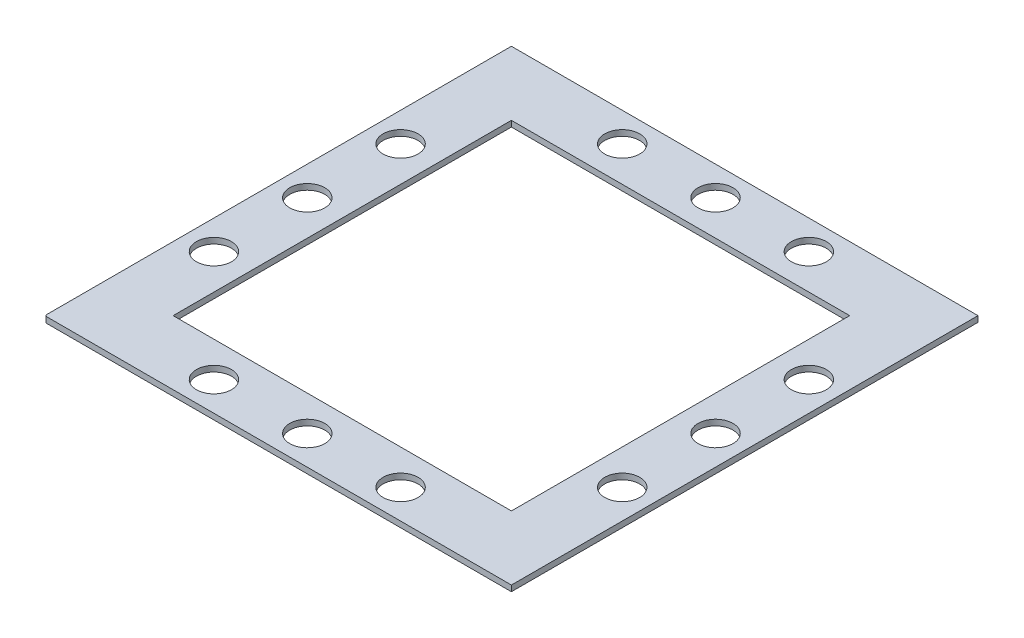
ISO-10303-21;
HEADER;
FILE_DESCRIPTION(('STEP AP214'),'2;1');
FILE_NAME('part.step','',(''),(''),'','','');
FILE_SCHEMA(('AUTOMOTIVE_DESIGN { 1 0 10303 214 1 1 1 1 }'));
ENDSEC;
DATA;
#1=APPLICATION_CONTEXT('core data for automotive mechanical design processes');
#2=APPLICATION_PROTOCOL_DEFINITION('international standard','automotive_design',2000,#1);
#3=PRODUCT_CONTEXT('',#1,'mechanical');
#4=PRODUCT('Part','Part','',(#3));
#5=PRODUCT_RELATED_PRODUCT_CATEGORY('part','',(#4));
#6=PRODUCT_DEFINITION_FORMATION('','',#4);
#7=PRODUCT_DEFINITION_CONTEXT('part definition',#1,'design');
#8=PRODUCT_DEFINITION('design','',#6,#7);
#9=PRODUCT_DEFINITION_SHAPE('','',#8);
#10=(LENGTH_UNIT() NAMED_UNIT(*) SI_UNIT(.MILLI.,.METRE.));
#11=(NAMED_UNIT(*) PLANE_ANGLE_UNIT() SI_UNIT($,.RADIAN.));
#12=(NAMED_UNIT(*) SI_UNIT($,.STERADIAN.) SOLID_ANGLE_UNIT());
#13=UNCERTAINTY_MEASURE_WITH_UNIT(LENGTH_MEASURE(1.E-05),#10,'distance_accuracy_value','');
#14=(GEOMETRIC_REPRESENTATION_CONTEXT(3) GLOBAL_UNCERTAINTY_ASSIGNED_CONTEXT((#13)) GLOBAL_UNIT_ASSIGNED_CONTEXT((#10,
#11,#12)) REPRESENTATION_CONTEXT('',''));
#15=CARTESIAN_POINT('',(0.,0.,0.));
#16=DIRECTION('',(0.,0.,1.));
#17=DIRECTION('',(1.,0.,0.));
#18=AXIS2_PLACEMENT_3D('',#15,#16,#17);
#19=CARTESIAN_POINT('',(-5.5,0.5,0.));
#20=DIRECTION('',(-1.,0.,0.));
#21=DIRECTION('',(0.,0.,1.));
#22=AXIS2_PLACEMENT_3D('',#19,#20,#21);
#23=PLANE('',#22);
#24=DIRECTION('',(0.,0.,-1.));
#25=VECTOR('',#24,1.);
#26=CARTESIAN_POINT('',(-5.5,0.,0.));
#27=LINE('',#26,#25);
#28=CARTESIAN_POINT('',(-5.5,0.,5.38138411801248));
#29=VERTEX_POINT('',#28);
#30=CARTESIAN_POINT('',(-5.5,0.,-34.5));
#31=VERTEX_POINT('',#30);
#32=EDGE_CURVE('E163',#29,#31,#27,.T.);
#33=ORIENTED_EDGE('',*,*,#32,.F.);
#34=DIRECTION('',(0.,-1.,0.));
#35=VECTOR('',#34,1.);
#36=CARTESIAN_POINT('',(-5.5,0.5,5.38138411801248));
#37=LINE('',#36,#35);
#38=CARTESIAN_POINT('',(-5.5,0.5,5.38138411801248));
#39=VERTEX_POINT('',#38);
#40=EDGE_CURVE('E11',#39,#29,#37,.T.);
#41=ORIENTED_EDGE('',*,*,#40,.F.);
#42=DIRECTION('',(0.,0.,-1.));
#43=VECTOR('',#42,1.);
#44=CARTESIAN_POINT('',(-5.5,0.5,0.));
#45=LINE('',#44,#43);
#46=CARTESIAN_POINT('',(-5.5,0.5,-34.5));
#47=VERTEX_POINT('',#46);
#48=EDGE_CURVE('E214',#39,#47,#45,.T.);
#49=ORIENTED_EDGE('',*,*,#48,.T.);
#50=DIRECTION('',(0.,-1.,0.));
#51=VECTOR('',#50,1.);
#52=CARTESIAN_POINT('',(-5.5,0.5,-34.5));
#53=LINE('',#52,#51);
#54=EDGE_CURVE('E54',#47,#31,#53,.T.);
#55=ORIENTED_EDGE('',*,*,#54,.T.);
#56=EDGE_LOOP('',(#33,#41,#49,#55));
#57=FACE_BOUND('',#56,.T.);
#58=ADVANCED_FACE('F35',(#57),#23,.T.);
#59=CARTESIAN_POINT('',(-2.7911178304985,0.5,3.16509050214004));
#60=DIRECTION('',(0.,-1.,0.));
#61=DIRECTION('',(0.,0.,-1.));
#62=AXIS2_PLACEMENT_3D('',#59,#60,#61);
#63=CYLINDRICAL_SURFACE('',#62,3.50000000000001);
#64=CARTESIAN_POINT('',(-2.7911178304985,0.,3.16509050214004));
#65=DIRECTION('',(0.,1.,0.));
#66=DIRECTION('',(0.,0.,1.));
#67=AXIS2_PLACEMENT_3D('',#64,#65,#66);
#68=CIRCLE('',#67,3.50000000000001);
#69=CARTESIAN_POINT('',(-5.39845318230953,0.,5.49999999999997));
#70=VERTEX_POINT('',#69);
#71=EDGE_CURVE('E160',#29,#70,#68,.T.);
#72=ORIENTED_EDGE('',*,*,#71,.T.);
#73=DIRECTION('',(0.,-1.,0.));
#74=VECTOR('',#73,1.);
#75=CARTESIAN_POINT('',(-5.39845318230953,0.5,5.49999999999997));
#76=LINE('',#75,#74);
#77=CARTESIAN_POINT('',(-5.39845318230953,0.5,5.49999999999997));
#78=VERTEX_POINT('',#77);
#79=EDGE_CURVE('E45',#78,#70,#76,.T.);
#80=ORIENTED_EDGE('',*,*,#79,.F.);
#81=CARTESIAN_POINT('',(-2.7911178304985,0.5,3.16509050214004));
#82=DIRECTION('',(0.,1.,0.));
#83=DIRECTION('',(0.,0.,1.));
#84=AXIS2_PLACEMENT_3D('',#81,#82,#83);
#85=CIRCLE('',#84,3.50000000000001);
#86=EDGE_CURVE('E128',#39,#78,#85,.T.);
#87=ORIENTED_EDGE('',*,*,#86,.F.);
#88=ORIENTED_EDGE('',*,*,#40,.T.);
#89=EDGE_LOOP('',(#72,#80,#87,#88));
#90=FACE_BOUND('',#89,.T.);
#91=ADVANCED_FACE('F312',(#90),#63,.T.);
#92=CARTESIAN_POINT('',(0.,0.5,5.49999999999997));
#93=DIRECTION('',(0.,0.,-1.));
#94=DIRECTION('',(-1.,0.,0.));
#95=AXIS2_PLACEMENT_3D('',#92,#93,#94);
#96=PLANE('',#95);
#97=DIRECTION('',(1.,0.,0.));
#98=VECTOR('',#97,1.);
#99=CARTESIAN_POINT('',(0.,0.,5.49999999999997));
#100=LINE('',#99,#98);
#101=CARTESIAN_POINT('',(34.5,0.,5.49999999999997));
#102=VERTEX_POINT('',#101);
#103=EDGE_CURVE('E134',#70,#102,#100,.T.);
#104=ORIENTED_EDGE('',*,*,#103,.T.);
#105=DIRECTION('',(0.,-1.,0.));
#106=VECTOR('',#105,1.);
#107=CARTESIAN_POINT('',(34.5,0.5,5.49999999999997));
#108=LINE('',#107,#106);
#109=CARTESIAN_POINT('',(34.5,0.5,5.49999999999997));
#110=VERTEX_POINT('',#109);
#111=EDGE_CURVE('E117',#110,#102,#108,.T.);
#112=ORIENTED_EDGE('',*,*,#111,.F.);
#113=DIRECTION('',(1.,0.,0.));
#114=VECTOR('',#113,1.);
#115=CARTESIAN_POINT('',(0.,0.5,5.49999999999997));
#116=LINE('',#115,#114);
#117=EDGE_CURVE('E122',#78,#110,#116,.T.);
#118=ORIENTED_EDGE('',*,*,#117,.F.);
#119=ORIENTED_EDGE('',*,*,#79,.T.);
#120=EDGE_LOOP('',(#104,#112,#118,#119));
#121=FACE_BOUND('',#120,.T.);
#122=ADVANCED_FACE('F133',(#121),#96,.F.);
#123=CARTESIAN_POINT('',(34.5,0.5,0.));
#124=DIRECTION('',(-1.,0.,0.));
#125=DIRECTION('',(0.,0.,1.));
#126=AXIS2_PLACEMENT_3D('',#123,#124,#125);
#127=PLANE('',#126);
#128=DIRECTION('',(0.,0.,-1.));
#129=VECTOR('',#128,1.);
#130=CARTESIAN_POINT('',(34.5,0.,0.));
#131=LINE('',#130,#129);
#132=CARTESIAN_POINT('',(34.5,0.,-34.5));
#133=VERTEX_POINT('',#132);
#134=EDGE_CURVE('E157',#102,#133,#131,.T.);
#135=ORIENTED_EDGE('',*,*,#134,.T.);
#136=DIRECTION('',(0.,-1.,0.));
#137=VECTOR('',#136,1.);
#138=CARTESIAN_POINT('',(34.5,0.5,-34.5));
#139=LINE('',#138,#137);
#140=CARTESIAN_POINT('',(34.5,0.5,-34.5));
#141=VERTEX_POINT('',#140);
#142=EDGE_CURVE('E83',#141,#133,#139,.T.);
#143=ORIENTED_EDGE('',*,*,#142,.F.);
#144=DIRECTION('',(0.,0.,-1.));
#145=VECTOR('',#144,1.);
#146=CARTESIAN_POINT('',(34.5,0.5,0.));
#147=LINE('',#146,#145);
#148=EDGE_CURVE('E113',#110,#141,#147,.T.);
#149=ORIENTED_EDGE('',*,*,#148,.F.);
#150=ORIENTED_EDGE('',*,*,#111,.T.);
#151=EDGE_LOOP('',(#135,#143,#149,#150));
#152=FACE_BOUND('',#151,.T.);
#153=ADVANCED_FACE('F115',(#152),#127,.F.);
#154=CARTESIAN_POINT('',(29.,0.5,0.));
#155=DIRECTION('',(-1.,0.,0.));
#156=DIRECTION('',(0.,0.,1.));
#157=AXIS2_PLACEMENT_3D('',#154,#155,#156);
#158=PLANE('',#157);
#159=DIRECTION('',(0.,0.,-1.));
#160=VECTOR('',#159,1.);
#161=CARTESIAN_POINT('',(29.,0.,0.));
#162=LINE('',#161,#160);
#163=CARTESIAN_POINT('',(29.,0.,0.));
#164=VERTEX_POINT('',#163);
#165=CARTESIAN_POINT('',(29.,0.,-29.));
#166=VERTEX_POINT('',#165);
#167=EDGE_CURVE('E173',#164,#166,#162,.T.);
#168=ORIENTED_EDGE('',*,*,#167,.F.);
#169=DIRECTION('',(0.,-1.,0.));
#170=VECTOR('',#169,1.);
#171=CARTESIAN_POINT('',(29.,0.5,0.));
#172=LINE('',#171,#170);
#173=CARTESIAN_POINT('',(29.,0.5,0.));
#174=VERTEX_POINT('',#173);
#175=EDGE_CURVE('E39',#174,#164,#172,.T.);
#176=ORIENTED_EDGE('',*,*,#175,.F.);
#177=DIRECTION('',(0.,0.,-1.));
#178=VECTOR('',#177,1.);
#179=CARTESIAN_POINT('',(29.,0.5,0.));
#180=LINE('',#179,#178);
#181=CARTESIAN_POINT('',(29.,0.5,-29.));
#182=VERTEX_POINT('',#181);
#183=EDGE_CURVE('E223',#174,#182,#180,.T.);
#184=ORIENTED_EDGE('',*,*,#183,.T.);
#185=DIRECTION('',(0.,-1.,0.));
#186=VECTOR('',#185,1.);
#187=CARTESIAN_POINT('',(29.,0.5,-29.));
#188=LINE('',#187,#186);
#189=EDGE_CURVE('E140',#182,#166,#188,.T.);
#190=ORIENTED_EDGE('',*,*,#189,.T.);
#191=EDGE_LOOP('',(#168,#176,#184,#190));
#192=FACE_BOUND('',#191,.T.);
#193=ADVANCED_FACE('F297',(#192),#158,.T.);
#194=CARTESIAN_POINT('',(0.,0.5,0.));
#195=DIRECTION('',(0.,0.,-1.));
#196=DIRECTION('',(-1.,0.,0.));
#197=AXIS2_PLACEMENT_3D('',#194,#195,#196);
#198=PLANE('',#197);
#199=DIRECTION('',(1.,0.,0.));
#200=VECTOR('',#199,1.);
#201=CARTESIAN_POINT('',(0.,0.,0.));
#202=LINE('',#201,#200);
#203=CARTESIAN_POINT('',(0.,0.,0.));
#204=VERTEX_POINT('',#203);
#205=EDGE_CURVE('E170',#204,#164,#202,.T.);
#206=ORIENTED_EDGE('',*,*,#205,.F.);
#207=DIRECTION('',(0.,-1.,0.));
#208=VECTOR('',#207,1.);
#209=CARTESIAN_POINT('',(0.,0.5,0.));
#210=LINE('',#209,#208);
#211=CARTESIAN_POINT('',(0.,0.5,0.));
#212=VERTEX_POINT('',#211);
#213=EDGE_CURVE('E144',#212,#204,#210,.T.);
#214=ORIENTED_EDGE('',*,*,#213,.F.);
#215=DIRECTION('',(1.,0.,0.));
#216=VECTOR('',#215,1.);
#217=CARTESIAN_POINT('',(0.,0.5,0.));
#218=LINE('',#217,#216);
#219=EDGE_CURVE('E221',#212,#174,#218,.T.);
#220=ORIENTED_EDGE('',*,*,#219,.T.);
#221=ORIENTED_EDGE('',*,*,#175,.T.);
#222=EDGE_LOOP('',(#206,#214,#220,#221));
#223=FACE_BOUND('',#222,.T.);
#224=ADVANCED_FACE('F292',(#223),#198,.T.);
#225=CARTESIAN_POINT('',(0.,0.5,0.));
#226=DIRECTION('',(-1.,0.,0.));
#227=DIRECTION('',(0.,0.,1.));
#228=AXIS2_PLACEMENT_3D('',#225,#226,#227);
#229=PLANE('',#228);
#230=DIRECTION('',(0.,0.,-1.));
#231=VECTOR('',#230,1.);
#232=CARTESIAN_POINT('',(0.,0.,0.));
#233=LINE('',#232,#231);
#234=CARTESIAN_POINT('',(0.,0.,-29.));
#235=VERTEX_POINT('',#234);
#236=EDGE_CURVE('E168',#204,#235,#233,.T.);
#237=ORIENTED_EDGE('',*,*,#236,.T.);
#238=DIRECTION('',(0.,-1.,0.));
#239=VECTOR('',#238,1.);
#240=CARTESIAN_POINT('',(0.,0.5,-29.));
#241=LINE('',#240,#239);
#242=CARTESIAN_POINT('',(0.,0.5,-29.));
#243=VERTEX_POINT('',#242);
#244=EDGE_CURVE('E142',#243,#235,#241,.T.);
#245=ORIENTED_EDGE('',*,*,#244,.F.);
#246=DIRECTION('',(0.,0.,-1.));
#247=VECTOR('',#246,1.);
#248=CARTESIAN_POINT('',(0.,0.5,0.));
#249=LINE('',#248,#247);
#250=EDGE_CURVE('E218',#212,#243,#249,.T.);
#251=ORIENTED_EDGE('',*,*,#250,.F.);
#252=ORIENTED_EDGE('',*,*,#213,.T.);
#253=EDGE_LOOP('',(#237,#245,#251,#252));
#254=FACE_BOUND('',#253,.T.);
#255=ADVANCED_FACE('F294',(#254),#229,.F.);
#256=CARTESIAN_POINT('',(0.,0.5,-29.));
#257=DIRECTION('',(0.,0.,-1.));
#258=DIRECTION('',(-1.,0.,0.));
#259=AXIS2_PLACEMENT_3D('',#256,#257,#258);
#260=PLANE('',#259);
#261=DIRECTION('',(1.,0.,0.));
#262=VECTOR('',#261,1.);
#263=CARTESIAN_POINT('',(0.,0.,-29.));
#264=LINE('',#263,#262);
#265=EDGE_CURVE('E165',#235,#166,#264,.T.);
#266=ORIENTED_EDGE('',*,*,#265,.T.);
#267=ORIENTED_EDGE('',*,*,#189,.F.);
#268=DIRECTION('',(1.,0.,0.));
#269=VECTOR('',#268,1.);
#270=CARTESIAN_POINT('',(0.,0.5,-29.));
#271=LINE('',#270,#269);
#272=EDGE_CURVE('E216',#243,#182,#271,.T.);
#273=ORIENTED_EDGE('',*,*,#272,.F.);
#274=ORIENTED_EDGE('',*,*,#244,.T.);
#275=EDGE_LOOP('',(#266,#267,#273,#274));
#276=FACE_BOUND('',#275,.T.);
#277=ADVANCED_FACE('F296',(#276),#260,.F.);
#278=CARTESIAN_POINT('',(6.50000000000001,0.5,2.99999999999998));
#279=DIRECTION('',(0.,-1.,0.));
#280=DIRECTION('',(0.,0.,-1.));
#281=AXIS2_PLACEMENT_3D('',#278,#279,#280);
#282=CYLINDRICAL_SURFACE('',#281,1.5);
#283=CARTESIAN_POINT('',(6.50000000000001,0.5,2.99999999999998));
#284=DIRECTION('',(0.,1.,0.));
#285=DIRECTION('',(0.,0.,1.));
#286=AXIS2_PLACEMENT_3D('',#283,#284,#285);
#287=CIRCLE('',#286,1.5);
#288=CARTESIAN_POINT('',(6.50000000000001,0.5,4.49999999999998));
#289=VERTEX_POINT('',#288);
#290=EDGE_CURVE('E225',#289,#289,#287,.T.);
#291=ORIENTED_EDGE('',*,*,#290,.T.);
#292=EDGE_LOOP('',(#291));
#293=FACE_BOUND('',#292,.T.);
#294=CARTESIAN_POINT('',(6.50000000000001,0.,2.99999999999998));
#295=DIRECTION('',(0.,1.,0.));
#296=DIRECTION('',(0.,0.,1.));
#297=AXIS2_PLACEMENT_3D('',#294,#295,#296);
#298=CIRCLE('',#297,1.5);
#299=CARTESIAN_POINT('',(6.50000000000001,0.,4.49999999999998));
#300=VERTEX_POINT('',#299);
#301=EDGE_CURVE('E176',#300,#300,#298,.T.);
#302=ORIENTED_EDGE('',*,*,#301,.F.);
#303=EDGE_LOOP('',(#302));
#304=FACE_BOUND('',#303,.T.);
#305=ADVANCED_FACE('F323',(#293,#304),#282,.F.);
#306=CARTESIAN_POINT('',(22.5,0.5,2.99999999999998));
#307=DIRECTION('',(0.,-1.,0.));
#308=DIRECTION('',(0.,0.,-1.));
#309=AXIS2_PLACEMENT_3D('',#306,#307,#308);
#310=CYLINDRICAL_SURFACE('',#309,1.5);
#311=CARTESIAN_POINT('',(22.5,0.5,2.99999999999998));
#312=DIRECTION('',(0.,1.,0.));
#313=DIRECTION('',(0.,0.,1.));
#314=AXIS2_PLACEMENT_3D('',#311,#312,#313);
#315=CIRCLE('',#314,1.5);
#316=CARTESIAN_POINT('',(22.5,0.5,4.49999999999998));
#317=VERTEX_POINT('',#316);
#318=EDGE_CURVE('E228',#317,#317,#315,.T.);
#319=ORIENTED_EDGE('',*,*,#318,.T.);
#320=EDGE_LOOP('',(#319));
#321=FACE_BOUND('',#320,.T.);
#322=CARTESIAN_POINT('',(22.5,0.,2.99999999999998));
#323=DIRECTION('',(0.,1.,0.));
#324=DIRECTION('',(0.,0.,1.));
#325=AXIS2_PLACEMENT_3D('',#322,#323,#324);
#326=CIRCLE('',#325,1.5);
#327=CARTESIAN_POINT('',(22.5,0.,4.49999999999998));
#328=VERTEX_POINT('',#327);
#329=EDGE_CURVE('E179',#328,#328,#326,.T.);
#330=ORIENTED_EDGE('',*,*,#329,.F.);
#331=EDGE_LOOP('',(#330));
#332=FACE_BOUND('',#331,.T.);
#333=ADVANCED_FACE('F332',(#321,#332),#310,.F.);
#334=CARTESIAN_POINT('',(-2.99999999999998,0.5,-22.5));
#335=DIRECTION('',(0.,-1.,0.));
#336=DIRECTION('',(0.,0.,-1.));
#337=AXIS2_PLACEMENT_3D('',#334,#335,#336);
#338=CYLINDRICAL_SURFACE('',#337,1.5);
#339=CARTESIAN_POINT('',(-2.99999999999998,0.5,-22.5));
#340=DIRECTION('',(0.,1.,0.));
#341=DIRECTION('',(0.,0.,1.));
#342=AXIS2_PLACEMENT_3D('',#339,#340,#341);
#343=CIRCLE('',#342,1.5);
#344=CARTESIAN_POINT('',(-2.99999999999998,0.5,-21.));
#345=VERTEX_POINT('',#344);
#346=EDGE_CURVE('E231',#345,#345,#343,.T.);
#347=ORIENTED_EDGE('',*,*,#346,.T.);
#348=EDGE_LOOP('',(#347));
#349=FACE_BOUND('',#348,.T.);
#350=CARTESIAN_POINT('',(-2.99999999999998,0.,-22.5));
#351=DIRECTION('',(0.,1.,0.));
#352=DIRECTION('',(0.,0.,1.));
#353=AXIS2_PLACEMENT_3D('',#350,#351,#352);
#354=CIRCLE('',#353,1.5);
#355=CARTESIAN_POINT('',(-2.99999999999998,0.,-21.));
#356=VERTEX_POINT('',#355);
#357=EDGE_CURVE('E182',#356,#356,#354,.T.);
#358=ORIENTED_EDGE('',*,*,#357,.F.);
#359=EDGE_LOOP('',(#358));
#360=FACE_BOUND('',#359,.T.);
#361=ADVANCED_FACE('F336',(#349,#360),#338,.F.);
#362=CARTESIAN_POINT('',(-2.99999999999998,0.5,-6.50000000000001));
#363=DIRECTION('',(0.,-1.,0.));
#364=DIRECTION('',(0.,0.,-1.));
#365=AXIS2_PLACEMENT_3D('',#362,#363,#364);
#366=CYLINDRICAL_SURFACE('',#365,1.5);
#367=CARTESIAN_POINT('',(-2.99999999999998,0.5,-6.50000000000001));
#368=DIRECTION('',(0.,1.,0.));
#369=DIRECTION('',(0.,0.,1.));
#370=AXIS2_PLACEMENT_3D('',#367,#368,#369);
#371=CIRCLE('',#370,1.5);
#372=CARTESIAN_POINT('',(-2.99999999999998,0.5,-5.00000000000001));
#373=VERTEX_POINT('',#372);
#374=EDGE_CURVE('E234',#373,#373,#371,.T.);
#375=ORIENTED_EDGE('',*,*,#374,.T.);
#376=EDGE_LOOP('',(#375));
#377=FACE_BOUND('',#376,.T.);
#378=CARTESIAN_POINT('',(-2.99999999999998,0.,-6.50000000000001));
#379=DIRECTION('',(0.,1.,0.));
#380=DIRECTION('',(0.,0.,1.));
#381=AXIS2_PLACEMENT_3D('',#378,#379,#380);
#382=CIRCLE('',#381,1.5);
#383=CARTESIAN_POINT('',(-2.99999999999998,0.,-5.00000000000001));
#384=VERTEX_POINT('',#383);
#385=EDGE_CURVE('E185',#384,#384,#382,.T.);
#386=ORIENTED_EDGE('',*,*,#385,.F.);
#387=EDGE_LOOP('',(#386));
#388=FACE_BOUND('',#387,.T.);
#389=ADVANCED_FACE('F340',(#377,#388),#366,.F.);
#390=CARTESIAN_POINT('',(22.5,0.5,-32.));
#391=DIRECTION('',(0.,-1.,0.));
#392=DIRECTION('',(0.,0.,-1.));
#393=AXIS2_PLACEMENT_3D('',#390,#391,#392);
#394=CYLINDRICAL_SURFACE('',#393,1.5);
#395=CARTESIAN_POINT('',(22.5,0.5,-32.));
#396=DIRECTION('',(0.,1.,0.));
#397=DIRECTION('',(0.,0.,1.));
#398=AXIS2_PLACEMENT_3D('',#395,#396,#397);
#399=CIRCLE('',#398,1.5);
#400=CARTESIAN_POINT('',(22.5,0.5,-30.5));
#401=VERTEX_POINT('',#400);
#402=EDGE_CURVE('E237',#401,#401,#399,.T.);
#403=ORIENTED_EDGE('',*,*,#402,.T.);
#404=EDGE_LOOP('',(#403));
#405=FACE_BOUND('',#404,.T.);
#406=CARTESIAN_POINT('',(22.5,0.,-32.));
#407=DIRECTION('',(0.,1.,0.));
#408=DIRECTION('',(0.,0.,1.));
#409=AXIS2_PLACEMENT_3D('',#406,#407,#408);
#410=CIRCLE('',#409,1.5);
#411=CARTESIAN_POINT('',(22.5,0.,-30.5));
#412=VERTEX_POINT('',#411);
#413=EDGE_CURVE('E188',#412,#412,#410,.T.);
#414=ORIENTED_EDGE('',*,*,#413,.F.);
#415=EDGE_LOOP('',(#414));
#416=FACE_BOUND('',#415,.T.);
#417=ADVANCED_FACE('F344',(#405,#416),#394,.F.);
#418=CARTESIAN_POINT('',(6.50000000000001,0.5,-32.));
#419=DIRECTION('',(0.,-1.,0.));
#420=DIRECTION('',(0.,0.,-1.));
#421=AXIS2_PLACEMENT_3D('',#418,#419,#420);
#422=CYLINDRICAL_SURFACE('',#421,1.5);
#423=CARTESIAN_POINT('',(6.50000000000001,0.5,-32.));
#424=DIRECTION('',(0.,1.,0.));
#425=DIRECTION('',(0.,0.,1.));
#426=AXIS2_PLACEMENT_3D('',#423,#424,#425);
#427=CIRCLE('',#426,1.5);
#428=CARTESIAN_POINT('',(6.50000000000001,0.5,-30.5));
#429=VERTEX_POINT('',#428);
#430=EDGE_CURVE('E240',#429,#429,#427,.T.);
#431=ORIENTED_EDGE('',*,*,#430,.T.);
#432=EDGE_LOOP('',(#431));
#433=FACE_BOUND('',#432,.T.);
#434=CARTESIAN_POINT('',(6.50000000000001,0.,-32.));
#435=DIRECTION('',(0.,1.,0.));
#436=DIRECTION('',(0.,0.,1.));
#437=AXIS2_PLACEMENT_3D('',#434,#435,#436);
#438=CIRCLE('',#437,1.5);
#439=CARTESIAN_POINT('',(6.50000000000001,0.,-30.5));
#440=VERTEX_POINT('',#439);
#441=EDGE_CURVE('E191',#440,#440,#438,.T.);
#442=ORIENTED_EDGE('',*,*,#441,.F.);
#443=EDGE_LOOP('',(#442));
#444=FACE_BOUND('',#443,.T.);
#445=ADVANCED_FACE('F348',(#433,#444),#422,.F.);
#446=CARTESIAN_POINT('',(32.,0.5,-6.50000000000001));
#447=DIRECTION('',(0.,-1.,0.));
#448=DIRECTION('',(0.,0.,-1.));
#449=AXIS2_PLACEMENT_3D('',#446,#447,#448);
#450=CYLINDRICAL_SURFACE('',#449,1.5);
#451=CARTESIAN_POINT('',(32.,0.5,-6.50000000000001));
#452=DIRECTION('',(0.,1.,0.));
#453=DIRECTION('',(0.,0.,1.));
#454=AXIS2_PLACEMENT_3D('',#451,#452,#453);
#455=CIRCLE('',#454,1.5);
#456=CARTESIAN_POINT('',(32.,0.5,-5.00000000000001));
#457=VERTEX_POINT('',#456);
#458=EDGE_CURVE('E243',#457,#457,#455,.T.);
#459=ORIENTED_EDGE('',*,*,#458,.T.);
#460=EDGE_LOOP('',(#459));
#461=FACE_BOUND('',#460,.T.);
#462=CARTESIAN_POINT('',(32.,0.,-6.50000000000001));
#463=DIRECTION('',(0.,1.,0.));
#464=DIRECTION('',(0.,0.,1.));
#465=AXIS2_PLACEMENT_3D('',#462,#463,#464);
#466=CIRCLE('',#465,1.5);
#467=CARTESIAN_POINT('',(32.,0.,-5.00000000000001));
#468=VERTEX_POINT('',#467);
#469=EDGE_CURVE('E194',#468,#468,#466,.T.);
#470=ORIENTED_EDGE('',*,*,#469,.F.);
#471=EDGE_LOOP('',(#470));
#472=FACE_BOUND('',#471,.T.);
#473=ADVANCED_FACE('F352',(#461,#472),#450,.F.);
#474=CARTESIAN_POINT('',(32.,0.5,-22.5));
#475=DIRECTION('',(0.,-1.,0.));
#476=DIRECTION('',(0.,0.,-1.));
#477=AXIS2_PLACEMENT_3D('',#474,#475,#476);
#478=CYLINDRICAL_SURFACE('',#477,1.5);
#479=CARTESIAN_POINT('',(32.,0.5,-22.5));
#480=DIRECTION('',(0.,1.,0.));
#481=DIRECTION('',(0.,0.,1.));
#482=AXIS2_PLACEMENT_3D('',#479,#480,#481);
#483=CIRCLE('',#482,1.5);
#484=CARTESIAN_POINT('',(32.,0.5,-21.));
#485=VERTEX_POINT('',#484);
#486=EDGE_CURVE('E246',#485,#485,#483,.T.);
#487=ORIENTED_EDGE('',*,*,#486,.T.);
#488=EDGE_LOOP('',(#487));
#489=FACE_BOUND('',#488,.T.);
#490=CARTESIAN_POINT('',(32.,0.,-22.5));
#491=DIRECTION('',(0.,1.,0.));
#492=DIRECTION('',(0.,0.,1.));
#493=AXIS2_PLACEMENT_3D('',#490,#491,#492);
#494=CIRCLE('',#493,1.5);
#495=CARTESIAN_POINT('',(32.,0.,-21.));
#496=VERTEX_POINT('',#495);
#497=EDGE_CURVE('E197',#496,#496,#494,.T.);
#498=ORIENTED_EDGE('',*,*,#497,.F.);
#499=EDGE_LOOP('',(#498));
#500=FACE_BOUND('',#499,.T.);
#501=ADVANCED_FACE('F356',(#489,#500),#478,.F.);
#502=CARTESIAN_POINT('',(14.5,0.5,2.99999999999998));
#503=DIRECTION('',(0.,-1.,0.));
#504=DIRECTION('',(0.,0.,-1.));
#505=AXIS2_PLACEMENT_3D('',#502,#503,#504);
#506=CYLINDRICAL_SURFACE('',#505,1.5);
#507=CARTESIAN_POINT('',(14.5,0.5,2.99999999999998));
#508=DIRECTION('',(0.,1.,0.));
#509=DIRECTION('',(0.,0.,1.));
#510=AXIS2_PLACEMENT_3D('',#507,#508,#509);
#511=CIRCLE('',#510,1.5);
#512=CARTESIAN_POINT('',(14.5,0.5,4.49999999999998));
#513=VERTEX_POINT('',#512);
#514=EDGE_CURVE('E249',#513,#513,#511,.T.);
#515=ORIENTED_EDGE('',*,*,#514,.T.);
#516=EDGE_LOOP('',(#515));
#517=FACE_BOUND('',#516,.T.);
#518=CARTESIAN_POINT('',(14.5,0.,2.99999999999998));
#519=DIRECTION('',(0.,1.,0.));
#520=DIRECTION('',(0.,0.,1.));
#521=AXIS2_PLACEMENT_3D('',#518,#519,#520);
#522=CIRCLE('',#521,1.5);
#523=CARTESIAN_POINT('',(14.5,0.,4.49999999999998));
#524=VERTEX_POINT('',#523);
#525=EDGE_CURVE('E200',#524,#524,#522,.T.);
#526=ORIENTED_EDGE('',*,*,#525,.F.);
#527=EDGE_LOOP('',(#526));
#528=FACE_BOUND('',#527,.T.);
#529=ADVANCED_FACE('F360',(#517,#528),#506,.F.);
#530=CARTESIAN_POINT('',(-2.99999999999998,0.5,-14.5000000000001));
#531=DIRECTION('',(0.,-1.,0.));
#532=DIRECTION('',(0.,0.,-1.));
#533=AXIS2_PLACEMENT_3D('',#530,#531,#532);
#534=CYLINDRICAL_SURFACE('',#533,1.5);
#535=CARTESIAN_POINT('',(-2.99999999999998,0.5,-14.5000000000001));
#536=DIRECTION('',(0.,1.,0.));
#537=DIRECTION('',(0.,0.,1.));
#538=AXIS2_PLACEMENT_3D('',#535,#536,#537);
#539=CIRCLE('',#538,1.5);
#540=CARTESIAN_POINT('',(-2.99999999999998,0.5,-13.0000000000001));
#541=VERTEX_POINT('',#540);
#542=EDGE_CURVE('E252',#541,#541,#539,.T.);
#543=ORIENTED_EDGE('',*,*,#542,.T.);
#544=EDGE_LOOP('',(#543));
#545=FACE_BOUND('',#544,.T.);
#546=CARTESIAN_POINT('',(-2.99999999999998,0.,-14.5000000000001));
#547=DIRECTION('',(0.,1.,0.));
#548=DIRECTION('',(0.,0.,1.));
#549=AXIS2_PLACEMENT_3D('',#546,#547,#548);
#550=CIRCLE('',#549,1.5);
#551=CARTESIAN_POINT('',(-2.99999999999998,0.,-13.0000000000001));
#552=VERTEX_POINT('',#551);
#553=EDGE_CURVE('E203',#552,#552,#550,.T.);
#554=ORIENTED_EDGE('',*,*,#553,.F.);
#555=EDGE_LOOP('',(#554));
#556=FACE_BOUND('',#555,.T.);
#557=ADVANCED_FACE('F364',(#545,#556),#534,.F.);
#558=CARTESIAN_POINT('',(14.5000000000001,0.5,-32.));
#559=DIRECTION('',(0.,-1.,0.));
#560=DIRECTION('',(0.,0.,-1.));
#561=AXIS2_PLACEMENT_3D('',#558,#559,#560);
#562=CYLINDRICAL_SURFACE('',#561,1.5);
#563=CARTESIAN_POINT('',(14.5000000000001,0.5,-32.));
#564=DIRECTION('',(0.,1.,0.));
#565=DIRECTION('',(0.,0.,1.));
#566=AXIS2_PLACEMENT_3D('',#563,#564,#565);
#567=CIRCLE('',#566,1.5);
#568=CARTESIAN_POINT('',(14.5000000000001,0.5,-30.5));
#569=VERTEX_POINT('',#568);
#570=EDGE_CURVE('E255',#569,#569,#567,.T.);
#571=ORIENTED_EDGE('',*,*,#570,.T.);
#572=EDGE_LOOP('',(#571));
#573=FACE_BOUND('',#572,.T.);
#574=CARTESIAN_POINT('',(14.5000000000001,0.,-32.));
#575=DIRECTION('',(0.,1.,0.));
#576=DIRECTION('',(0.,0.,1.));
#577=AXIS2_PLACEMENT_3D('',#574,#575,#576);
#578=CIRCLE('',#577,1.5);
#579=CARTESIAN_POINT('',(14.5000000000001,0.,-30.5));
#580=VERTEX_POINT('',#579);
#581=EDGE_CURVE('E206',#580,#580,#578,.T.);
#582=ORIENTED_EDGE('',*,*,#581,.F.);
#583=EDGE_LOOP('',(#582));
#584=FACE_BOUND('',#583,.T.);
#585=ADVANCED_FACE('F309',(#573,#584),#562,.F.);
#586=CARTESIAN_POINT('',(32.,0.5,-14.4999999999998));
#587=DIRECTION('',(0.,-1.,0.));
#588=DIRECTION('',(0.,0.,-1.));
#589=AXIS2_PLACEMENT_3D('',#586,#587,#588);
#590=CYLINDRICAL_SURFACE('',#589,1.5);
#591=CARTESIAN_POINT('',(32.,0.5,-14.4999999999998));
#592=DIRECTION('',(0.,1.,0.));
#593=DIRECTION('',(0.,0.,1.));
#594=AXIS2_PLACEMENT_3D('',#591,#592,#593);
#595=CIRCLE('',#594,1.5);
#596=CARTESIAN_POINT('',(32.,0.5,-12.9999999999998));
#597=VERTEX_POINT('',#596);
#598=EDGE_CURVE('E156',#597,#597,#595,.T.);
#599=ORIENTED_EDGE('',*,*,#598,.T.);
#600=EDGE_LOOP('',(#599));
#601=FACE_BOUND('',#600,.T.);
#602=CARTESIAN_POINT('',(32.,0.,-14.4999999999998));
#603=DIRECTION('',(0.,1.,0.));
#604=DIRECTION('',(0.,0.,1.));
#605=AXIS2_PLACEMENT_3D('',#602,#603,#604);
#606=CIRCLE('',#605,1.5);
#607=CARTESIAN_POINT('',(32.,0.,-12.9999999999998));
#608=VERTEX_POINT('',#607);
#609=EDGE_CURVE('E209',#608,#608,#606,.T.);
#610=ORIENTED_EDGE('',*,*,#609,.F.);
#611=EDGE_LOOP('',(#610));
#612=FACE_BOUND('',#611,.T.);
#613=ADVANCED_FACE('F37',(#601,#612),#590,.F.);
#614=CARTESIAN_POINT('',(0.,0.5,-34.5));
#615=DIRECTION('',(0.,0.,-1.));
#616=DIRECTION('',(-1.,0.,0.));
#617=AXIS2_PLACEMENT_3D('',#614,#615,#616);
#618=PLANE('',#617);
#619=DIRECTION('',(1.,0.,0.));
#620=VECTOR('',#619,1.);
#621=CARTESIAN_POINT('',(0.,0.,-34.5));
#622=LINE('',#621,#620);
#623=EDGE_CURVE('E153',#31,#133,#622,.T.);
#624=ORIENTED_EDGE('',*,*,#623,.F.);
#625=ORIENTED_EDGE('',*,*,#54,.F.);
#626=DIRECTION('',(1.,0.,0.));
#627=VECTOR('',#626,1.);
#628=CARTESIAN_POINT('',(0.,0.5,-34.5));
#629=LINE('',#628,#627);
#630=EDGE_CURVE('E121',#47,#141,#629,.T.);
#631=ORIENTED_EDGE('',*,*,#630,.T.);
#632=ORIENTED_EDGE('',*,*,#142,.T.);
#633=EDGE_LOOP('',(#624,#625,#631,#632));
#634=FACE_BOUND('',#633,.T.);
#635=ADVANCED_FACE('F266',(#634),#618,.T.);
#636=CARTESIAN_POINT('',(0.,0.5,0.));
#637=DIRECTION('',(0.,1.,0.));
#638=DIRECTION('',(0.,0.,1.));
#639=AXIS2_PLACEMENT_3D('',#636,#637,#638);
#640=PLANE('',#639);
#641=ORIENTED_EDGE('',*,*,#598,.F.);
#642=EDGE_LOOP('',(#641));
#643=FACE_BOUND('',#642,.T.);
#644=ORIENTED_EDGE('',*,*,#570,.F.);
#645=EDGE_LOOP('',(#644));
#646=FACE_BOUND('',#645,.T.);
#647=ORIENTED_EDGE('',*,*,#542,.F.);
#648=EDGE_LOOP('',(#647));
#649=FACE_BOUND('',#648,.T.);
#650=ORIENTED_EDGE('',*,*,#514,.F.);
#651=EDGE_LOOP('',(#650));
#652=FACE_BOUND('',#651,.T.);
#653=ORIENTED_EDGE('',*,*,#486,.F.);
#654=EDGE_LOOP('',(#653));
#655=FACE_BOUND('',#654,.T.);
#656=ORIENTED_EDGE('',*,*,#458,.F.);
#657=EDGE_LOOP('',(#656));
#658=FACE_BOUND('',#657,.T.);
#659=ORIENTED_EDGE('',*,*,#430,.F.);
#660=EDGE_LOOP('',(#659));
#661=FACE_BOUND('',#660,.T.);
#662=ORIENTED_EDGE('',*,*,#402,.F.);
#663=EDGE_LOOP('',(#662));
#664=FACE_BOUND('',#663,.T.);
#665=ORIENTED_EDGE('',*,*,#374,.F.);
#666=EDGE_LOOP('',(#665));
#667=FACE_BOUND('',#666,.T.);
#668=ORIENTED_EDGE('',*,*,#346,.F.);
#669=EDGE_LOOP('',(#668));
#670=FACE_BOUND('',#669,.T.);
#671=ORIENTED_EDGE('',*,*,#318,.F.);
#672=EDGE_LOOP('',(#671));
#673=FACE_BOUND('',#672,.T.);
#674=ORIENTED_EDGE('',*,*,#290,.F.);
#675=EDGE_LOOP('',(#674));
#676=FACE_BOUND('',#675,.T.);
#677=ORIENTED_EDGE('',*,*,#183,.F.);
#678=ORIENTED_EDGE('',*,*,#219,.F.);
#679=ORIENTED_EDGE('',*,*,#250,.T.);
#680=ORIENTED_EDGE('',*,*,#272,.T.);
#681=EDGE_LOOP('',(#677,#678,#679,#680));
#682=FACE_BOUND('',#681,.T.);
#683=ORIENTED_EDGE('',*,*,#48,.F.);
#684=ORIENTED_EDGE('',*,*,#86,.T.);
#685=ORIENTED_EDGE('',*,*,#117,.T.);
#686=ORIENTED_EDGE('',*,*,#148,.T.);
#687=ORIENTED_EDGE('',*,*,#630,.F.);
#688=EDGE_LOOP('',(#683,#684,#685,#686,#687));
#689=FACE_BOUND('',#688,.T.);
#690=ADVANCED_FACE('F126',(#643,#646,#649,#652,#655,#658,#661,#664,#667,#670,#673,#676,#682,
#689),#640,.T.);
#691=CARTESIAN_POINT('',(0.,0.,0.));
#692=DIRECTION('',(0.,1.,0.));
#693=DIRECTION('',(0.,0.,1.));
#694=AXIS2_PLACEMENT_3D('',#691,#692,#693);
#695=PLANE('',#694);
#696=ORIENTED_EDGE('',*,*,#609,.T.);
#697=EDGE_LOOP('',(#696));
#698=FACE_BOUND('',#697,.T.);
#699=ORIENTED_EDGE('',*,*,#581,.T.);
#700=EDGE_LOOP('',(#699));
#701=FACE_BOUND('',#700,.T.);
#702=ORIENTED_EDGE('',*,*,#553,.T.);
#703=EDGE_LOOP('',(#702));
#704=FACE_BOUND('',#703,.T.);
#705=ORIENTED_EDGE('',*,*,#525,.T.);
#706=EDGE_LOOP('',(#705));
#707=FACE_BOUND('',#706,.T.);
#708=ORIENTED_EDGE('',*,*,#497,.T.);
#709=EDGE_LOOP('',(#708));
#710=FACE_BOUND('',#709,.T.);
#711=ORIENTED_EDGE('',*,*,#469,.T.);
#712=EDGE_LOOP('',(#711));
#713=FACE_BOUND('',#712,.T.);
#714=ORIENTED_EDGE('',*,*,#441,.T.);
#715=EDGE_LOOP('',(#714));
#716=FACE_BOUND('',#715,.T.);
#717=ORIENTED_EDGE('',*,*,#413,.T.);
#718=EDGE_LOOP('',(#717));
#719=FACE_BOUND('',#718,.T.);
#720=ORIENTED_EDGE('',*,*,#385,.T.);
#721=EDGE_LOOP('',(#720));
#722=FACE_BOUND('',#721,.T.);
#723=ORIENTED_EDGE('',*,*,#357,.T.);
#724=EDGE_LOOP('',(#723));
#725=FACE_BOUND('',#724,.T.);
#726=ORIENTED_EDGE('',*,*,#329,.T.);
#727=EDGE_LOOP('',(#726));
#728=FACE_BOUND('',#727,.T.);
#729=ORIENTED_EDGE('',*,*,#301,.T.);
#730=EDGE_LOOP('',(#729));
#731=FACE_BOUND('',#730,.T.);
#732=ORIENTED_EDGE('',*,*,#167,.T.);
#733=ORIENTED_EDGE('',*,*,#265,.F.);
#734=ORIENTED_EDGE('',*,*,#236,.F.);
#735=ORIENTED_EDGE('',*,*,#205,.T.);
#736=EDGE_LOOP('',(#732,#733,#734,#735));
#737=FACE_BOUND('',#736,.T.);
#738=ORIENTED_EDGE('',*,*,#32,.T.);
#739=ORIENTED_EDGE('',*,*,#623,.T.);
#740=ORIENTED_EDGE('',*,*,#134,.F.);
#741=ORIENTED_EDGE('',*,*,#103,.F.);
#742=ORIENTED_EDGE('',*,*,#71,.F.);
#743=EDGE_LOOP('',(#738,#739,#740,#741,#742));
#744=FACE_BOUND('',#743,.T.);
#745=ADVANCED_FACE('F265',(#698,#701,#704,#707,#710,#713,#716,#719,#722,#725,#728,#731,#737,
#744),#695,.F.);
#746=CLOSED_SHELL('',(#58,#91,#122,#153,#193,#224,#255,#277,#305,#333,#361,#389,#417,#445,#473,
#501,#529,#557,#585,#613,#635,#690,#745));
#747=MANIFOLD_SOLID_BREP('B2',#746);
#748=ADVANCED_BREP_SHAPE_REPRESENTATION('',(#18,#747),#14);
#749=SHAPE_DEFINITION_REPRESENTATION(#9,#748);
ENDSEC;
END-ISO-10303-21;
